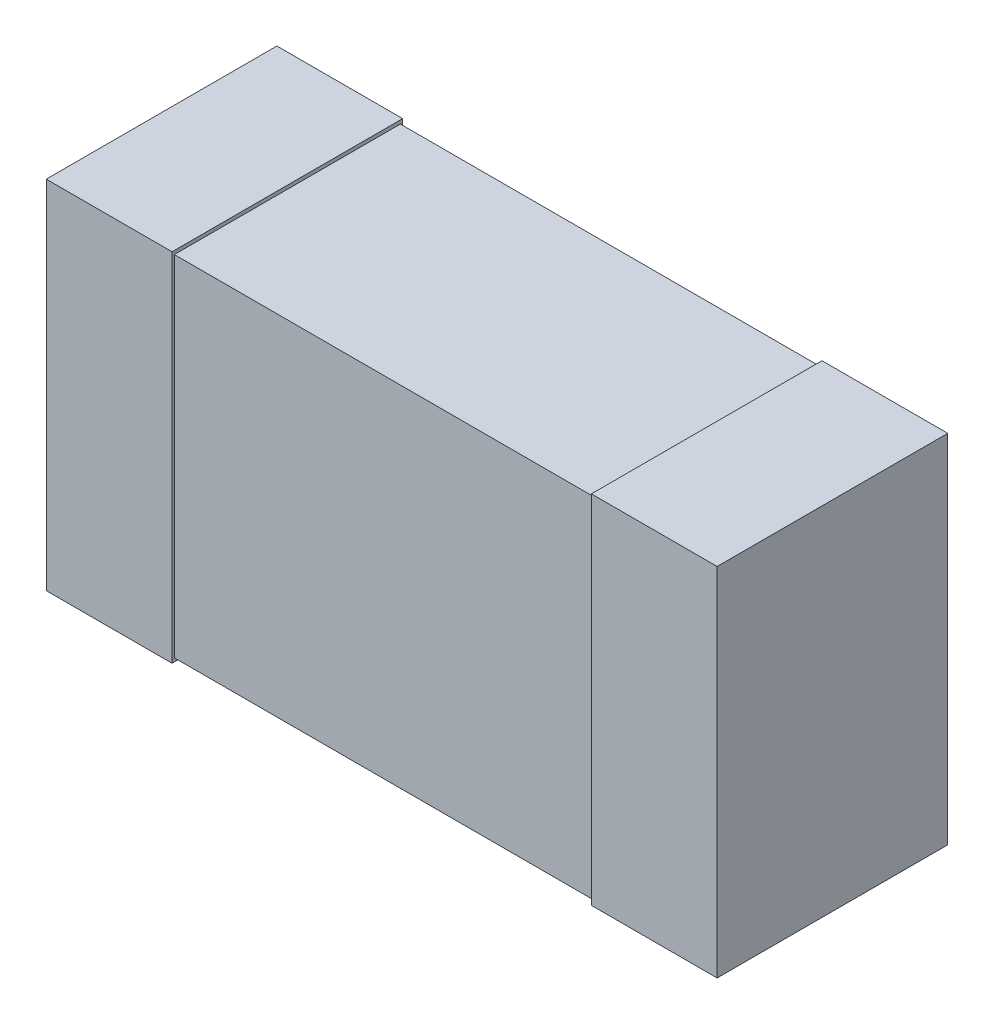
ISO-10303-21;
HEADER;
FILE_DESCRIPTION(('STEP AP214'),'2;1');
FILE_NAME('part.step','',(''),(''),'','','');
FILE_SCHEMA(('AUTOMOTIVE_DESIGN { 1 0 10303 214 1 1 1 1 }'));
ENDSEC;
DATA;
#1=APPLICATION_CONTEXT('core data for automotive mechanical design processes');
#2=APPLICATION_PROTOCOL_DEFINITION('international standard','automotive_design',2000,#1);
#3=PRODUCT_CONTEXT('',#1,'mechanical');
#4=PRODUCT('Part','Part','',(#3));
#5=PRODUCT_RELATED_PRODUCT_CATEGORY('part','',(#4));
#6=PRODUCT_DEFINITION_FORMATION('','',#4);
#7=PRODUCT_DEFINITION_CONTEXT('part definition',#1,'design');
#8=PRODUCT_DEFINITION('design','',#6,#7);
#9=PRODUCT_DEFINITION_SHAPE('','',#8);
#10=(LENGTH_UNIT() NAMED_UNIT(*) SI_UNIT(.MILLI.,.METRE.));
#11=(NAMED_UNIT(*) PLANE_ANGLE_UNIT() SI_UNIT($,.RADIAN.));
#12=(NAMED_UNIT(*) SI_UNIT($,.STERADIAN.) SOLID_ANGLE_UNIT());
#13=UNCERTAINTY_MEASURE_WITH_UNIT(LENGTH_MEASURE(1.E-05),#10,'distance_accuracy_value','');
#14=(GEOMETRIC_REPRESENTATION_CONTEXT(3) GLOBAL_UNCERTAINTY_ASSIGNED_CONTEXT((#13)) GLOBAL_UNIT_ASSIGNED_CONTEXT((#10,
#11,#12)) REPRESENTATION_CONTEXT('',''));
#15=CARTESIAN_POINT('',(0.,0.,0.));
#16=DIRECTION('',(0.,0.,1.));
#17=DIRECTION('',(1.,0.,0.));
#18=AXIS2_PLACEMENT_3D('',#15,#16,#17);
#19=CARTESIAN_POINT('',(-0.5,-0.4165,0.5445));
#20=DIRECTION('',(0.,0.,1.));
#21=DIRECTION('',(1.,0.,0.));
#22=AXIS2_PLACEMENT_3D('',#19,#20,#21);
#23=PLANE('',#22);
#24=DIRECTION('',(0.,1.,0.));
#25=VECTOR('',#24,1.);
#26=CARTESIAN_POINT('',(-0.5,-0.4165,0.5445));
#27=LINE('',#26,#25);
#28=CARTESIAN_POINT('',(-0.5,-0.4165,0.5445));
#29=VERTEX_POINT('',#28);
#30=CARTESIAN_POINT('',(-0.5,0.4165,0.5445));
#31=VERTEX_POINT('',#30);
#32=EDGE_CURVE('P0_E87',#29,#31,#27,.T.);
#33=ORIENTED_EDGE('',*,*,#32,.F.);
#34=DIRECTION('',(1.,0.,0.));
#35=VECTOR('',#34,1.);
#36=CARTESIAN_POINT('',(-0.5,-0.4165,0.5445));
#37=LINE('',#36,#35);
#38=CARTESIAN_POINT('',(0.5,-0.4165,0.5445));
#39=VERTEX_POINT('',#38);
#40=EDGE_CURVE('P0_E70',#29,#39,#37,.T.);
#41=ORIENTED_EDGE('',*,*,#40,.T.);
#42=DIRECTION('',(0.,1.,0.));
#43=VECTOR('',#42,1.);
#44=CARTESIAN_POINT('',(0.5,-0.4165,0.5445));
#45=LINE('',#44,#43);
#46=CARTESIAN_POINT('',(0.5,0.4165,0.5445));
#47=VERTEX_POINT('',#46);
#48=EDGE_CURVE('P0_E82',#39,#47,#45,.T.);
#49=ORIENTED_EDGE('',*,*,#48,.T.);
#50=DIRECTION('',(1.,0.,0.));
#51=VECTOR('',#50,1.);
#52=CARTESIAN_POINT('',(-0.5,0.4165,0.5445));
#53=LINE('',#52,#51);
#54=EDGE_CURVE('P0_E10',#31,#47,#53,.T.);
#55=ORIENTED_EDGE('',*,*,#54,.F.);
#56=EDGE_LOOP('',(#33,#41,#49,#55));
#57=FACE_BOUND('',#56,.T.);
#58=ADVANCED_FACE('P0_F17',(#57),#23,.T.);
#59=CARTESIAN_POINT('',(-0.5,-0.4165,0.0055));
#60=DIRECTION('',(0.,0.,1.));
#61=DIRECTION('',(1.,0.,0.));
#62=AXIS2_PLACEMENT_3D('',#59,#60,#61);
#63=PLANE('',#62);
#64=DIRECTION('',(1.,0.,0.));
#65=VECTOR('',#64,1.);
#66=CARTESIAN_POINT('',(-0.5,0.4165,0.0055));
#67=LINE('',#66,#65);
#68=CARTESIAN_POINT('',(-0.5,0.4165,0.0055));
#69=VERTEX_POINT('',#68);
#70=CARTESIAN_POINT('',(0.5,0.4165,0.0055));
#71=VERTEX_POINT('',#70);
#72=EDGE_CURVE('P0_E25',#69,#71,#67,.T.);
#73=ORIENTED_EDGE('',*,*,#72,.T.);
#74=DIRECTION('',(0.,1.,0.));
#75=VECTOR('',#74,1.);
#76=CARTESIAN_POINT('',(0.5,-0.4165,0.0055));
#77=LINE('',#76,#75);
#78=CARTESIAN_POINT('',(0.5,-0.4165,0.0055));
#79=VERTEX_POINT('',#78);
#80=EDGE_CURVE('P0_E108',#79,#71,#77,.T.);
#81=ORIENTED_EDGE('',*,*,#80,.F.);
#82=DIRECTION('',(1.,0.,0.));
#83=VECTOR('',#82,1.);
#84=CARTESIAN_POINT('',(-0.5,-0.4165,0.0055));
#85=LINE('',#84,#83);
#86=CARTESIAN_POINT('',(-0.5,-0.4165,0.0055));
#87=VERTEX_POINT('',#86);
#88=EDGE_CURVE('P0_E81',#87,#79,#85,.T.);
#89=ORIENTED_EDGE('',*,*,#88,.F.);
#90=DIRECTION('',(0.,1.,0.));
#91=VECTOR('',#90,1.);
#92=CARTESIAN_POINT('',(-0.5,-0.4165,0.0055));
#93=LINE('',#92,#91);
#94=EDGE_CURVE('P0_E88',#87,#69,#93,.T.);
#95=ORIENTED_EDGE('',*,*,#94,.T.);
#96=EDGE_LOOP('',(#73,#81,#89,#95));
#97=FACE_BOUND('',#96,.T.);
#98=ADVANCED_FACE('P0_F121',(#97),#63,.F.);
#99=CARTESIAN_POINT('',(-0.5,0.4165,0.0055));
#100=DIRECTION('',(0.,1.,0.));
#101=DIRECTION('',(1.,0.,0.));
#102=AXIS2_PLACEMENT_3D('',#99,#100,#101);
#103=PLANE('',#102);
#104=ORIENTED_EDGE('',*,*,#72,.F.);
#105=DIRECTION('',(0.,0.,1.));
#106=VECTOR('',#105,1.);
#107=CARTESIAN_POINT('',(-0.5,0.4165,0.0055));
#108=LINE('',#107,#106);
#109=EDGE_CURVE('P0_E92',#69,#31,#108,.T.);
#110=ORIENTED_EDGE('',*,*,#109,.T.);
#111=ORIENTED_EDGE('',*,*,#54,.T.);
#112=DIRECTION('',(0.,0.,1.));
#113=VECTOR('',#112,1.);
#114=CARTESIAN_POINT('',(0.5,0.4165,0.0055));
#115=LINE('',#114,#113);
#116=EDGE_CURVE('P0_E104',#71,#47,#115,.T.);
#117=ORIENTED_EDGE('',*,*,#116,.F.);
#118=EDGE_LOOP('',(#104,#110,#111,#117));
#119=FACE_BOUND('',#118,.T.);
#120=ADVANCED_FACE('P0_F119',(#119),#103,.T.);
#121=CARTESIAN_POINT('',(-0.5,-0.4165,0.0055));
#122=DIRECTION('',(0.,1.,0.));
#123=DIRECTION('',(1.,0.,0.));
#124=AXIS2_PLACEMENT_3D('',#121,#122,#123);
#125=PLANE('',#124);
#126=DIRECTION('',(0.,0.,1.));
#127=VECTOR('',#126,1.);
#128=CARTESIAN_POINT('',(0.5,-0.4165,0.0055));
#129=LINE('',#128,#127);
#130=EDGE_CURVE('P0_E76',#79,#39,#129,.T.);
#131=ORIENTED_EDGE('',*,*,#130,.T.);
#132=ORIENTED_EDGE('',*,*,#40,.F.);
#133=DIRECTION('',(0.,0.,1.));
#134=VECTOR('',#133,1.);
#135=CARTESIAN_POINT('',(-0.5,-0.4165,0.0055));
#136=LINE('',#135,#134);
#137=EDGE_CURVE('P0_E73',#87,#29,#136,.T.);
#138=ORIENTED_EDGE('',*,*,#137,.F.);
#139=ORIENTED_EDGE('',*,*,#88,.T.);
#140=EDGE_LOOP('',(#131,#132,#138,#139));
#141=FACE_BOUND('',#140,.T.);
#142=ADVANCED_FACE('P0_F72',(#141),#125,.F.);
#143=CARTESIAN_POINT('',(0.5,-0.4165,0.0055));
#144=DIRECTION('',(1.,0.,0.));
#145=DIRECTION('',(0.,1.,0.));
#146=AXIS2_PLACEMENT_3D('',#143,#144,#145);
#147=PLANE('',#146);
#148=ORIENTED_EDGE('',*,*,#130,.F.);
#149=ORIENTED_EDGE('',*,*,#80,.T.);
#150=ORIENTED_EDGE('',*,*,#116,.T.);
#151=ORIENTED_EDGE('',*,*,#48,.F.);
#152=EDGE_LOOP('',(#148,#149,#150,#151));
#153=FACE_BOUND('',#152,.T.);
#154=ADVANCED_FACE('P0_F118',(#153),#147,.T.);
#155=CARTESIAN_POINT('',(-0.5,-0.4165,0.0055));
#156=DIRECTION('',(1.,0.,0.));
#157=DIRECTION('',(0.,1.,0.));
#158=AXIS2_PLACEMENT_3D('',#155,#156,#157);
#159=PLANE('',#158);
#160=ORIENTED_EDGE('',*,*,#32,.T.);
#161=ORIENTED_EDGE('',*,*,#109,.F.);
#162=ORIENTED_EDGE('',*,*,#94,.F.);
#163=ORIENTED_EDGE('',*,*,#137,.T.);
#164=EDGE_LOOP('',(#160,#161,#162,#163));
#165=FACE_BOUND('',#164,.T.);
#166=ADVANCED_FACE('P0_F85',(#165),#159,.F.);
#167=CLOSED_SHELL('',(#58,#98,#120,#142,#154,#166));
#168=MANIFOLD_SOLID_BREP('P0_B1',#167);
#169=CARTESIAN_POINT('',(-0.8,-0.425,0.55));
#170=DIRECTION('',(0.,0.,1.));
#171=DIRECTION('',(1.,0.,0.));
#172=AXIS2_PLACEMENT_3D('',#169,#170,#171);
#173=PLANE('',#172);
#174=DIRECTION('',(0.,1.,0.));
#175=VECTOR('',#174,1.);
#176=CARTESIAN_POINT('',(-0.8,-0.425,0.55));
#177=LINE('',#176,#175);
#178=CARTESIAN_POINT('',(-0.8,-0.425,0.55));
#179=VERTEX_POINT('',#178);
#180=CARTESIAN_POINT('',(-0.8,0.425,0.55));
#181=VERTEX_POINT('',#180);
#182=EDGE_CURVE('P1_E90',#179,#181,#177,.T.);
#183=ORIENTED_EDGE('',*,*,#182,.F.);
#184=DIRECTION('',(1.,0.,0.));
#185=VECTOR('',#184,1.);
#186=CARTESIAN_POINT('',(-0.8,-0.425,0.55));
#187=LINE('',#186,#185);
#188=CARTESIAN_POINT('',(-0.5,-0.425,0.55));
#189=VERTEX_POINT('',#188);
#190=EDGE_CURVE('P1_E72',#179,#189,#187,.T.);
#191=ORIENTED_EDGE('',*,*,#190,.T.);
#192=DIRECTION('',(0.,1.,0.));
#193=VECTOR('',#192,1.);
#194=CARTESIAN_POINT('',(-0.5,-0.425,0.55));
#195=LINE('',#194,#193);
#196=CARTESIAN_POINT('',(-0.5,0.425,0.55));
#197=VERTEX_POINT('',#196);
#198=EDGE_CURVE('P1_E84',#189,#197,#195,.T.);
#199=ORIENTED_EDGE('',*,*,#198,.T.);
#200=DIRECTION('',(1.,0.,0.));
#201=VECTOR('',#200,1.);
#202=CARTESIAN_POINT('',(-0.8,0.425,0.55));
#203=LINE('',#202,#201);
#204=EDGE_CURVE('P1_E11',#181,#197,#203,.T.);
#205=ORIENTED_EDGE('',*,*,#204,.F.);
#206=EDGE_LOOP('',(#183,#191,#199,#205));
#207=FACE_BOUND('',#206,.T.);
#208=ADVANCED_FACE('P1_F18',(#207),#173,.T.);
#209=CARTESIAN_POINT('',(-0.8,-0.425,0.));
#210=DIRECTION('',(0.,0.,1.));
#211=DIRECTION('',(1.,0.,0.));
#212=AXIS2_PLACEMENT_3D('',#209,#210,#211);
#213=PLANE('',#212);
#214=DIRECTION('',(1.,0.,0.));
#215=VECTOR('',#214,1.);
#216=CARTESIAN_POINT('',(-0.8,0.425,0.));
#217=LINE('',#216,#215);
#218=CARTESIAN_POINT('',(-0.8,0.425,0.));
#219=VERTEX_POINT('',#218);
#220=CARTESIAN_POINT('',(-0.5,0.425,0.));
#221=VERTEX_POINT('',#220);
#222=EDGE_CURVE('P1_E27',#219,#221,#217,.T.);
#223=ORIENTED_EDGE('',*,*,#222,.T.);
#224=DIRECTION('',(0.,1.,0.));
#225=VECTOR('',#224,1.);
#226=CARTESIAN_POINT('',(-0.5,-0.425,0.));
#227=LINE('',#226,#225);
#228=CARTESIAN_POINT('',(-0.5,-0.425,0.));
#229=VERTEX_POINT('',#228);
#230=EDGE_CURVE('P1_E106',#229,#221,#227,.T.);
#231=ORIENTED_EDGE('',*,*,#230,.F.);
#232=DIRECTION('',(1.,0.,0.));
#233=VECTOR('',#232,1.);
#234=CARTESIAN_POINT('',(-0.8,-0.425,0.));
#235=LINE('',#234,#233);
#236=CARTESIAN_POINT('',(-0.8,-0.425,0.));
#237=VERTEX_POINT('',#236);
#238=EDGE_CURVE('P1_E83',#237,#229,#235,.T.);
#239=ORIENTED_EDGE('',*,*,#238,.F.);
#240=DIRECTION('',(0.,1.,0.));
#241=VECTOR('',#240,1.);
#242=CARTESIAN_POINT('',(-0.8,-0.425,0.));
#243=LINE('',#242,#241);
#244=EDGE_CURVE('P1_E91',#237,#219,#243,.T.);
#245=ORIENTED_EDGE('',*,*,#244,.T.);
#246=EDGE_LOOP('',(#223,#231,#239,#245));
#247=FACE_BOUND('',#246,.T.);
#248=ADVANCED_FACE('P1_F20',(#247),#213,.F.);
#249=CARTESIAN_POINT('',(-0.8,0.425,0.));
#250=DIRECTION('',(0.,1.,0.));
#251=DIRECTION('',(1.,0.,0.));
#252=AXIS2_PLACEMENT_3D('',#249,#250,#251);
#253=PLANE('',#252);
#254=ORIENTED_EDGE('',*,*,#222,.F.);
#255=DIRECTION('',(0.,0.,1.));
#256=VECTOR('',#255,1.);
#257=CARTESIAN_POINT('',(-0.8,0.425,0.));
#258=LINE('',#257,#256);
#259=EDGE_CURVE('P1_E95',#219,#181,#258,.T.);
#260=ORIENTED_EDGE('',*,*,#259,.T.);
#261=ORIENTED_EDGE('',*,*,#204,.T.);
#262=DIRECTION('',(0.,0.,1.));
#263=VECTOR('',#262,1.);
#264=CARTESIAN_POINT('',(-0.5,0.425,0.));
#265=LINE('',#264,#263);
#266=EDGE_CURVE('P1_E110',#221,#197,#265,.T.);
#267=ORIENTED_EDGE('',*,*,#266,.F.);
#268=EDGE_LOOP('',(#254,#260,#261,#267));
#269=FACE_BOUND('',#268,.T.);
#270=ADVANCED_FACE('P1_F177',(#269),#253,.T.);
#271=CARTESIAN_POINT('',(-0.8,-0.425,0.));
#272=DIRECTION('',(0.,1.,0.));
#273=DIRECTION('',(1.,0.,0.));
#274=AXIS2_PLACEMENT_3D('',#271,#272,#273);
#275=PLANE('',#274);
#276=DIRECTION('',(0.,0.,1.));
#277=VECTOR('',#276,1.);
#278=CARTESIAN_POINT('',(-0.5,-0.425,0.));
#279=LINE('',#278,#277);
#280=EDGE_CURVE('P1_E78',#229,#189,#279,.T.);
#281=ORIENTED_EDGE('',*,*,#280,.T.);
#282=ORIENTED_EDGE('',*,*,#190,.F.);
#283=DIRECTION('',(0.,0.,1.));
#284=VECTOR('',#283,1.);
#285=CARTESIAN_POINT('',(-0.8,-0.425,0.));
#286=LINE('',#285,#284);
#287=EDGE_CURVE('P1_E75',#237,#179,#286,.T.);
#288=ORIENTED_EDGE('',*,*,#287,.F.);
#289=ORIENTED_EDGE('',*,*,#238,.T.);
#290=EDGE_LOOP('',(#281,#282,#288,#289));
#291=FACE_BOUND('',#290,.T.);
#292=ADVANCED_FACE('P1_F74',(#291),#275,.F.);
#293=CARTESIAN_POINT('',(-0.5,-0.425,0.));
#294=DIRECTION('',(1.,0.,0.));
#295=DIRECTION('',(0.,1.,0.));
#296=AXIS2_PLACEMENT_3D('',#293,#294,#295);
#297=PLANE('',#296);
#298=ORIENTED_EDGE('',*,*,#280,.F.);
#299=ORIENTED_EDGE('',*,*,#230,.T.);
#300=ORIENTED_EDGE('',*,*,#266,.T.);
#301=ORIENTED_EDGE('',*,*,#198,.F.);
#302=EDGE_LOOP('',(#298,#299,#300,#301));
#303=FACE_BOUND('',#302,.T.);
#304=ADVANCED_FACE('P1_F121',(#303),#297,.T.);
#305=CARTESIAN_POINT('',(-0.8,-0.425,0.));
#306=DIRECTION('',(1.,0.,0.));
#307=DIRECTION('',(0.,1.,0.));
#308=AXIS2_PLACEMENT_3D('',#305,#306,#307);
#309=PLANE('',#308);
#310=ORIENTED_EDGE('',*,*,#182,.T.);
#311=ORIENTED_EDGE('',*,*,#259,.F.);
#312=ORIENTED_EDGE('',*,*,#244,.F.);
#313=ORIENTED_EDGE('',*,*,#287,.T.);
#314=EDGE_LOOP('',(#310,#311,#312,#313));
#315=FACE_BOUND('',#314,.T.);
#316=ADVANCED_FACE('P1_F88',(#315),#309,.F.);
#317=CLOSED_SHELL('',(#208,#248,#270,#292,#304,#316));
#318=MANIFOLD_SOLID_BREP('P1_B1',#317);
#319=CARTESIAN_POINT('',(0.5,-0.425,0.55));
#320=DIRECTION('',(0.,0.,1.));
#321=DIRECTION('',(1.,0.,0.));
#322=AXIS2_PLACEMENT_3D('',#319,#320,#321);
#323=PLANE('',#322);
#324=DIRECTION('',(0.,1.,0.));
#325=VECTOR('',#324,1.);
#326=CARTESIAN_POINT('',(0.5,-0.425,0.55));
#327=LINE('',#326,#325);
#328=CARTESIAN_POINT('',(0.5,-0.425,0.55));
#329=VERTEX_POINT('',#328);
#330=CARTESIAN_POINT('',(0.5,0.425,0.55));
#331=VERTEX_POINT('',#330);
#332=EDGE_CURVE('P2_E90',#329,#331,#327,.T.);
#333=ORIENTED_EDGE('',*,*,#332,.F.);
#334=DIRECTION('',(1.,0.,0.));
#335=VECTOR('',#334,1.);
#336=CARTESIAN_POINT('',(0.5,-0.425,0.55));
#337=LINE('',#336,#335);
#338=CARTESIAN_POINT('',(0.8,-0.425,0.55));
#339=VERTEX_POINT('',#338);
#340=EDGE_CURVE('P2_E72',#329,#339,#337,.T.);
#341=ORIENTED_EDGE('',*,*,#340,.T.);
#342=DIRECTION('',(0.,1.,0.));
#343=VECTOR('',#342,1.);
#344=CARTESIAN_POINT('',(0.8,-0.425,0.55));
#345=LINE('',#344,#343);
#346=CARTESIAN_POINT('',(0.8,0.425,0.55));
#347=VERTEX_POINT('',#346);
#348=EDGE_CURVE('P2_E84',#339,#347,#345,.T.);
#349=ORIENTED_EDGE('',*,*,#348,.T.);
#350=DIRECTION('',(1.,0.,0.));
#351=VECTOR('',#350,1.);
#352=CARTESIAN_POINT('',(0.5,0.425,0.55));
#353=LINE('',#352,#351);
#354=EDGE_CURVE('P2_E11',#331,#347,#353,.T.);
#355=ORIENTED_EDGE('',*,*,#354,.F.);
#356=EDGE_LOOP('',(#333,#341,#349,#355));
#357=FACE_BOUND('',#356,.T.);
#358=ADVANCED_FACE('P2_F18',(#357),#323,.T.);
#359=CARTESIAN_POINT('',(0.5,-0.425,0.));
#360=DIRECTION('',(0.,0.,1.));
#361=DIRECTION('',(1.,0.,0.));
#362=AXIS2_PLACEMENT_3D('',#359,#360,#361);
#363=PLANE('',#362);
#364=DIRECTION('',(1.,0.,0.));
#365=VECTOR('',#364,1.);
#366=CARTESIAN_POINT('',(0.5,0.425,0.));
#367=LINE('',#366,#365);
#368=CARTESIAN_POINT('',(0.5,0.425,0.));
#369=VERTEX_POINT('',#368);
#370=CARTESIAN_POINT('',(0.8,0.425,0.));
#371=VERTEX_POINT('',#370);
#372=EDGE_CURVE('P2_E27',#369,#371,#367,.T.);
#373=ORIENTED_EDGE('',*,*,#372,.T.);
#374=DIRECTION('',(0.,1.,0.));
#375=VECTOR('',#374,1.);
#376=CARTESIAN_POINT('',(0.8,-0.425,0.));
#377=LINE('',#376,#375);
#378=CARTESIAN_POINT('',(0.8,-0.425,0.));
#379=VERTEX_POINT('',#378);
#380=EDGE_CURVE('P2_E109',#379,#371,#377,.T.);
#381=ORIENTED_EDGE('',*,*,#380,.F.);
#382=DIRECTION('',(1.,0.,0.));
#383=VECTOR('',#382,1.);
#384=CARTESIAN_POINT('',(0.5,-0.425,0.));
#385=LINE('',#384,#383);
#386=CARTESIAN_POINT('',(0.5,-0.425,0.));
#387=VERTEX_POINT('',#386);
#388=EDGE_CURVE('P2_E83',#387,#379,#385,.T.);
#389=ORIENTED_EDGE('',*,*,#388,.F.);
#390=DIRECTION('',(0.,1.,0.));
#391=VECTOR('',#390,1.);
#392=CARTESIAN_POINT('',(0.5,-0.425,0.));
#393=LINE('',#392,#391);
#394=EDGE_CURVE('P2_E91',#387,#369,#393,.T.);
#395=ORIENTED_EDGE('',*,*,#394,.T.);
#396=EDGE_LOOP('',(#373,#381,#389,#395));
#397=FACE_BOUND('',#396,.T.);
#398=ADVANCED_FACE('P2_F123',(#397),#363,.F.);
#399=CARTESIAN_POINT('',(0.5,0.425,0.));
#400=DIRECTION('',(0.,1.,0.));
#401=DIRECTION('',(1.,0.,0.));
#402=AXIS2_PLACEMENT_3D('',#399,#400,#401);
#403=PLANE('',#402);
#404=ORIENTED_EDGE('',*,*,#372,.F.);
#405=DIRECTION('',(0.,0.,1.));
#406=VECTOR('',#405,1.);
#407=CARTESIAN_POINT('',(0.5,0.425,0.));
#408=LINE('',#407,#406);
#409=EDGE_CURVE('P2_E95',#369,#331,#408,.T.);
#410=ORIENTED_EDGE('',*,*,#409,.T.);
#411=ORIENTED_EDGE('',*,*,#354,.T.);
#412=DIRECTION('',(0.,0.,1.));
#413=VECTOR('',#412,1.);
#414=CARTESIAN_POINT('',(0.8,0.425,0.));
#415=LINE('',#414,#413);
#416=EDGE_CURVE('P2_E105',#371,#347,#415,.T.);
#417=ORIENTED_EDGE('',*,*,#416,.F.);
#418=EDGE_LOOP('',(#404,#410,#411,#417));
#419=FACE_BOUND('',#418,.T.);
#420=ADVANCED_FACE('P2_F20',(#419),#403,.T.);
#421=CARTESIAN_POINT('',(0.5,-0.425,0.));
#422=DIRECTION('',(0.,1.,0.));
#423=DIRECTION('',(1.,0.,0.));
#424=AXIS2_PLACEMENT_3D('',#421,#422,#423);
#425=PLANE('',#424);
#426=DIRECTION('',(0.,0.,1.));
#427=VECTOR('',#426,1.);
#428=CARTESIAN_POINT('',(0.8,-0.425,0.));
#429=LINE('',#428,#427);
#430=EDGE_CURVE('P2_E78',#379,#339,#429,.T.);
#431=ORIENTED_EDGE('',*,*,#430,.T.);
#432=ORIENTED_EDGE('',*,*,#340,.F.);
#433=DIRECTION('',(0.,0.,1.));
#434=VECTOR('',#433,1.);
#435=CARTESIAN_POINT('',(0.5,-0.425,0.));
#436=LINE('',#435,#434);
#437=EDGE_CURVE('P2_E75',#387,#329,#436,.T.);
#438=ORIENTED_EDGE('',*,*,#437,.F.);
#439=ORIENTED_EDGE('',*,*,#388,.T.);
#440=EDGE_LOOP('',(#431,#432,#438,#439));
#441=FACE_BOUND('',#440,.T.);
#442=ADVANCED_FACE('P2_F74',(#441),#425,.F.);
#443=CARTESIAN_POINT('',(0.8,-0.425,0.));
#444=DIRECTION('',(1.,0.,0.));
#445=DIRECTION('',(0.,1.,0.));
#446=AXIS2_PLACEMENT_3D('',#443,#444,#445);
#447=PLANE('',#446);
#448=ORIENTED_EDGE('',*,*,#430,.F.);
#449=ORIENTED_EDGE('',*,*,#380,.T.);
#450=ORIENTED_EDGE('',*,*,#416,.T.);
#451=ORIENTED_EDGE('',*,*,#348,.F.);
#452=EDGE_LOOP('',(#448,#449,#450,#451));
#453=FACE_BOUND('',#452,.T.);
#454=ADVANCED_FACE('P2_F122',(#453),#447,.T.);
#455=CARTESIAN_POINT('',(0.5,-0.425,0.));
#456=DIRECTION('',(1.,0.,0.));
#457=DIRECTION('',(0.,1.,0.));
#458=AXIS2_PLACEMENT_3D('',#455,#456,#457);
#459=PLANE('',#458);
#460=ORIENTED_EDGE('',*,*,#332,.T.);
#461=ORIENTED_EDGE('',*,*,#409,.F.);
#462=ORIENTED_EDGE('',*,*,#394,.F.);
#463=ORIENTED_EDGE('',*,*,#437,.T.);
#464=EDGE_LOOP('',(#460,#461,#462,#463));
#465=FACE_BOUND('',#464,.T.);
#466=ADVANCED_FACE('P2_F88',(#465),#459,.F.);
#467=CLOSED_SHELL('',(#358,#398,#420,#442,#454,#466));
#468=MANIFOLD_SOLID_BREP('P2_B1',#467);
#469=ADVANCED_BREP_SHAPE_REPRESENTATION('',(#18,#168,#318,#468),#14);
#470=SHAPE_DEFINITION_REPRESENTATION(#9,#469);
ENDSEC;
END-ISO-10303-21;
